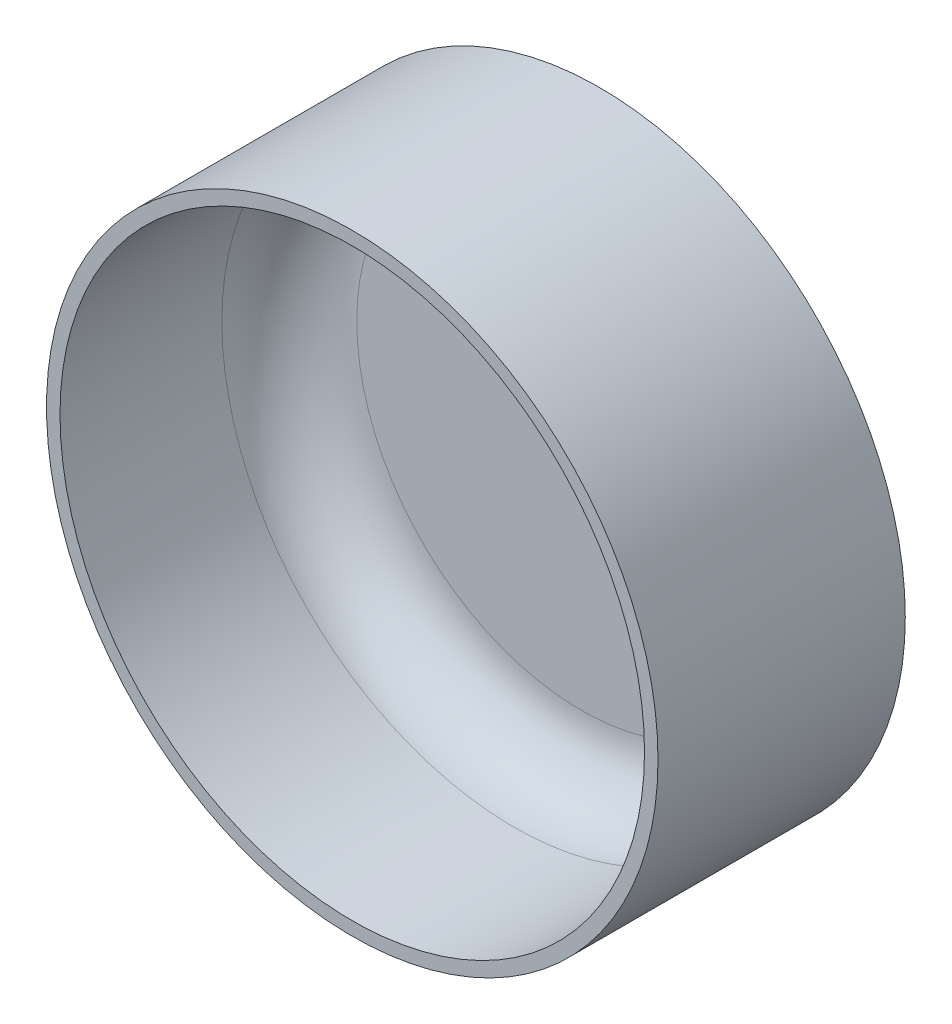
ISO-10303-21;
HEADER;
FILE_DESCRIPTION(('STEP AP214'),'2;1');
FILE_NAME('part.step','',(''),(''),'','','');
FILE_SCHEMA(('AUTOMOTIVE_DESIGN { 1 0 10303 214 1 1 1 1 }'));
ENDSEC;
DATA;
#1=APPLICATION_CONTEXT('core data for automotive mechanical design processes');
#2=APPLICATION_PROTOCOL_DEFINITION('international standard','automotive_design',2000,#1);
#3=PRODUCT_CONTEXT('',#1,'mechanical');
#4=PRODUCT('Part','Part','',(#3));
#5=PRODUCT_RELATED_PRODUCT_CATEGORY('part','',(#4));
#6=PRODUCT_DEFINITION_FORMATION('','',#4);
#7=PRODUCT_DEFINITION_CONTEXT('part definition',#1,'design');
#8=PRODUCT_DEFINITION('design','',#6,#7);
#9=PRODUCT_DEFINITION_SHAPE('','',#8);
#10=(LENGTH_UNIT() NAMED_UNIT(*) SI_UNIT(.MILLI.,.METRE.));
#11=(NAMED_UNIT(*) PLANE_ANGLE_UNIT() SI_UNIT($,.RADIAN.));
#12=(NAMED_UNIT(*) SI_UNIT($,.STERADIAN.) SOLID_ANGLE_UNIT());
#13=UNCERTAINTY_MEASURE_WITH_UNIT(LENGTH_MEASURE(1.E-05),#10,'distance_accuracy_value','');
#14=(GEOMETRIC_REPRESENTATION_CONTEXT(3) GLOBAL_UNCERTAINTY_ASSIGNED_CONTEXT((#13)) GLOBAL_UNIT_ASSIGNED_CONTEXT((#10,
#11,#12)) REPRESENTATION_CONTEXT('',''));
#15=CARTESIAN_POINT('',(0.,0.,0.));
#16=DIRECTION('',(0.,0.,1.));
#17=DIRECTION('',(1.,0.,0.));
#18=AXIS2_PLACEMENT_3D('',#15,#16,#17);
#19=CARTESIAN_POINT('',(0.,0.,55.));
#20=DIRECTION('',(0.,0.,-1.));
#21=DIRECTION('',(-1.,0.,0.));
#22=AXIS2_PLACEMENT_3D('',#19,#20,#21);
#23=CYLINDRICAL_SURFACE('',#22,65.);
#24=CARTESIAN_POINT('',(0.,0.,19.));
#25=DIRECTION('',(0.,0.,-1.));
#26=DIRECTION('',(-1.,0.,0.));
#27=AXIS2_PLACEMENT_3D('',#24,#25,#26);
#28=CIRCLE('',#27,65.);
#29=CARTESIAN_POINT('',(-65.,0.,19.));
#30=VERTEX_POINT('',#29);
#31=EDGE_CURVE('E55',#30,#30,#28,.T.);
#32=ORIENTED_EDGE('',*,*,#31,.T.);
#33=EDGE_LOOP('',(#32));
#34=FACE_BOUND('',#33,.T.);
#35=CARTESIAN_POINT('',(0.,0.,55.));
#36=DIRECTION('',(0.,0.,1.));
#37=DIRECTION('',(1.,0.,0.));
#38=AXIS2_PLACEMENT_3D('',#35,#36,#37);
#39=CIRCLE('',#38,65.);
#40=CARTESIAN_POINT('',(65.,0.,55.));
#41=VERTEX_POINT('',#40);
#42=EDGE_CURVE('E61',#41,#41,#39,.T.);
#43=ORIENTED_EDGE('',*,*,#42,.T.);
#44=EDGE_LOOP('',(#43));
#45=FACE_BOUND('',#44,.T.);
#46=ADVANCED_FACE('F44',(#34,#45),#23,.F.);
#47=CARTESIAN_POINT('',(0.,0.,55.));
#48=DIRECTION('',(0.,0.,1.));
#49=DIRECTION('',(1.,0.,0.));
#50=AXIS2_PLACEMENT_3D('',#47,#48,#49);
#51=PLANE('',#50);
#52=CARTESIAN_POINT('',(0.,0.,55.));
#53=DIRECTION('',(0.,0.,1.));
#54=DIRECTION('',(1.,0.,0.));
#55=AXIS2_PLACEMENT_3D('',#52,#53,#54);
#56=CIRCLE('',#55,68.);
#57=CARTESIAN_POINT('',(68.,0.,55.));
#58=VERTEX_POINT('',#57);
#59=EDGE_CURVE('E57',#58,#58,#56,.T.);
#60=ORIENTED_EDGE('',*,*,#59,.T.);
#61=EDGE_LOOP('',(#60));
#62=FACE_BOUND('',#61,.T.);
#63=ORIENTED_EDGE('',*,*,#42,.F.);
#64=EDGE_LOOP('',(#63));
#65=FACE_BOUND('',#64,.T.);
#66=ADVANCED_FACE('F68',(#62,#65),#51,.T.);
#67=CARTESIAN_POINT('',(0.,0.,0.));
#68=DIRECTION('',(0.,0.,1.));
#69=DIRECTION('',(1.,0.,0.));
#70=AXIS2_PLACEMENT_3D('',#67,#68,#69);
#71=PLANE('',#70);
#72=CARTESIAN_POINT('',(0.,0.,0.));
#73=DIRECTION('',(0.,0.,1.));
#74=DIRECTION('',(1.,0.,0.));
#75=AXIS2_PLACEMENT_3D('',#72,#73,#74);
#76=CIRCLE('',#75,68.);
#77=CARTESIAN_POINT('',(68.,0.,0.));
#78=VERTEX_POINT('',#77);
#79=EDGE_CURVE('E58',#78,#78,#76,.T.);
#80=ORIENTED_EDGE('',*,*,#79,.F.);
#81=EDGE_LOOP('',(#80));
#82=FACE_BOUND('',#81,.T.);
#83=ADVANCED_FACE('F75',(#82),#71,.F.);
#84=CARTESIAN_POINT('',(0.,0.,55.));
#85=DIRECTION('',(0.,0.,-1.));
#86=DIRECTION('',(-1.,0.,0.));
#87=AXIS2_PLACEMENT_3D('',#84,#85,#86);
#88=CYLINDRICAL_SURFACE('',#87,68.);
#89=ORIENTED_EDGE('',*,*,#79,.T.);
#90=EDGE_LOOP('',(#89));
#91=FACE_BOUND('',#90,.T.);
#92=ORIENTED_EDGE('',*,*,#59,.F.);
#93=EDGE_LOOP('',(#92));
#94=FACE_BOUND('',#93,.T.);
#95=ADVANCED_FACE('F80',(#91,#94),#88,.T.);
#96=CARTESIAN_POINT('',(0.,0.,4.));
#97=DIRECTION('',(0.,0.,-1.));
#98=DIRECTION('',(-1.,0.,0.));
#99=AXIS2_PLACEMENT_3D('',#96,#97,#98);
#100=PLANE('',#99);
#101=CARTESIAN_POINT('',(0.,0.,4.));
#102=DIRECTION('',(0.,0.,-1.));
#103=DIRECTION('',(-1.,0.,0.));
#104=AXIS2_PLACEMENT_3D('',#101,#102,#103);
#105=CIRCLE('',#104,50.);
#106=CARTESIAN_POINT('',(-50.,0.,4.));
#107=VERTEX_POINT('',#106);
#108=EDGE_CURVE('E11',#107,#107,#105,.F.);
#109=ORIENTED_EDGE('',*,*,#108,.T.);
#110=EDGE_LOOP('',(#109));
#111=FACE_BOUND('',#110,.T.);
#112=ADVANCED_FACE('F83',(#111),#100,.F.);
#113=CARTESIAN_POINT('',(0.,0.,19.));
#114=DIRECTION('',(0.,0.,-1.));
#115=DIRECTION('',(-1.,0.,0.));
#116=AXIS2_PLACEMENT_3D('',#113,#114,#115);
#117=TOROIDAL_SURFACE('',#116,50.,15.);
#118=ORIENTED_EDGE('',*,*,#108,.F.);
#119=EDGE_LOOP('',(#118));
#120=FACE_BOUND('',#119,.T.);
#121=ORIENTED_EDGE('',*,*,#31,.F.);
#122=EDGE_LOOP('',(#121));
#123=FACE_BOUND('',#122,.T.);
#124=ADVANCED_FACE('F50',(#120,#123),#117,.F.);
#125=CLOSED_SHELL('',(#46,#66,#83,#95,#112,#124));
#126=MANIFOLD_SOLID_BREP('B2',#125);
#127=ADVANCED_BREP_SHAPE_REPRESENTATION('',(#18,#126),#14);
#128=SHAPE_DEFINITION_REPRESENTATION(#9,#127);
ENDSEC;
END-ISO-10303-21;
